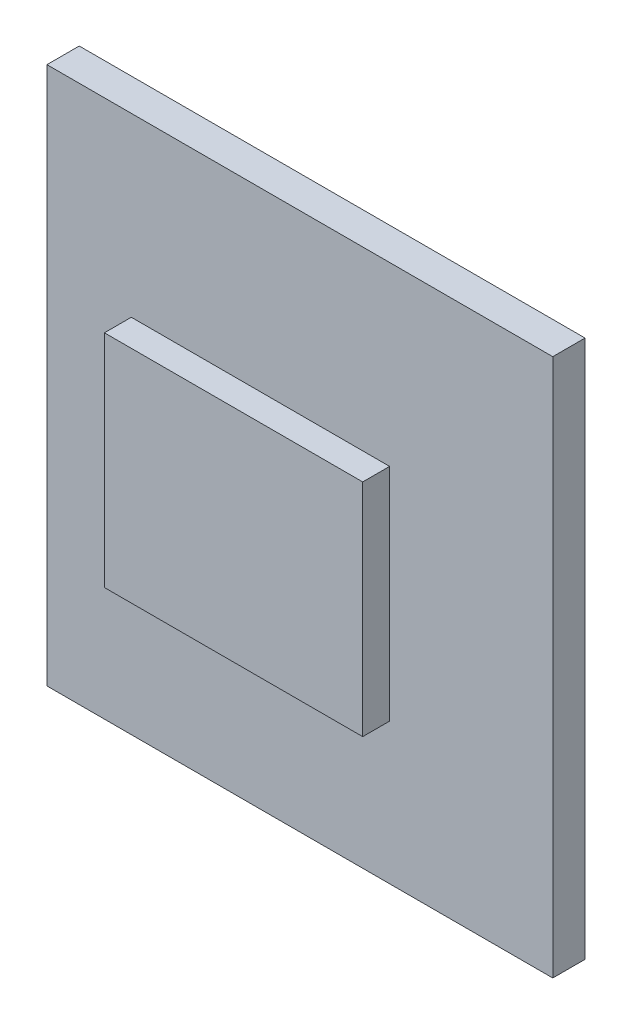
ISO-10303-21;
HEADER;
FILE_DESCRIPTION(('STEP AP214'),'2;1');
FILE_NAME('part.step','',(''),(''),'','','');
FILE_SCHEMA(('AUTOMOTIVE_DESIGN { 1 0 10303 214 1 1 1 1 }'));
ENDSEC;
DATA;
#1=APPLICATION_CONTEXT('core data for automotive mechanical design processes');
#2=APPLICATION_PROTOCOL_DEFINITION('international standard','automotive_design',2000,#1);
#3=PRODUCT_CONTEXT('',#1,'mechanical');
#4=PRODUCT('Part','Part','',(#3));
#5=PRODUCT_RELATED_PRODUCT_CATEGORY('part','',(#4));
#6=PRODUCT_DEFINITION_FORMATION('','',#4);
#7=PRODUCT_DEFINITION_CONTEXT('part definition',#1,'design');
#8=PRODUCT_DEFINITION('design','',#6,#7);
#9=PRODUCT_DEFINITION_SHAPE('','',#8);
#10=(LENGTH_UNIT() NAMED_UNIT(*) SI_UNIT(.MILLI.,.METRE.));
#11=(NAMED_UNIT(*) PLANE_ANGLE_UNIT() SI_UNIT($,.RADIAN.));
#12=(NAMED_UNIT(*) SI_UNIT($,.STERADIAN.) SOLID_ANGLE_UNIT());
#13=UNCERTAINTY_MEASURE_WITH_UNIT(LENGTH_MEASURE(1.E-05),#10,'distance_accuracy_value','');
#14=(GEOMETRIC_REPRESENTATION_CONTEXT(3) GLOBAL_UNCERTAINTY_ASSIGNED_CONTEXT((#13)) GLOBAL_UNIT_ASSIGNED_CONTEXT((#10,
#11,#12)) REPRESENTATION_CONTEXT('',''));
#15=CARTESIAN_POINT('',(0.,0.,0.));
#16=DIRECTION('',(0.,0.,1.));
#17=DIRECTION('',(1.,0.,0.));
#18=AXIS2_PLACEMENT_3D('',#15,#16,#17);
#19=CARTESIAN_POINT('',(0.,0.,0.6));
#20=DIRECTION('',(0.,0.,-1.));
#21=DIRECTION('',(-1.,0.,0.));
#22=AXIS2_PLACEMENT_3D('',#19,#20,#21);
#23=PLANE('',#22);
#24=DIRECTION('',(0.,-1.,0.));
#25=VECTOR('',#24,1.);
#26=CARTESIAN_POINT('',(0.,0.,0.6));
#27=LINE('',#26,#25);
#28=CARTESIAN_POINT('',(0.,10.,0.6));
#29=VERTEX_POINT('',#28);
#30=CARTESIAN_POINT('',(0.,0.,0.6));
#31=VERTEX_POINT('',#30);
#32=EDGE_CURVE('E130',#29,#31,#27,.T.);
#33=ORIENTED_EDGE('',*,*,#32,.T.);
#34=DIRECTION('',(1.,0.,0.));
#35=VECTOR('',#34,1.);
#36=CARTESIAN_POINT('',(0.,0.,0.6));
#37=LINE('',#36,#35);
#38=CARTESIAN_POINT('',(9.4,0.,0.6));
#39=VERTEX_POINT('',#38);
#40=EDGE_CURVE('E133',#31,#39,#37,.T.);
#41=ORIENTED_EDGE('',*,*,#40,.T.);
#42=DIRECTION('',(0.,1.,0.));
#43=VECTOR('',#42,1.);
#44=CARTESIAN_POINT('',(9.4,0.,0.6));
#45=LINE('',#44,#43);
#46=CARTESIAN_POINT('',(9.4,10.,0.6));
#47=VERTEX_POINT('',#46);
#48=EDGE_CURVE('E136',#39,#47,#45,.T.);
#49=ORIENTED_EDGE('',*,*,#48,.T.);
#50=DIRECTION('',(-1.,0.,0.));
#51=VECTOR('',#50,1.);
#52=CARTESIAN_POINT('',(0.,10.,0.6));
#53=LINE('',#52,#51);
#54=EDGE_CURVE('E138',#47,#29,#53,.T.);
#55=ORIENTED_EDGE('',*,*,#54,.T.);
#56=EDGE_LOOP('',(#33,#41,#49,#55));
#57=FACE_BOUND('',#56,.T.);
#58=DIRECTION('',(0.,-1.,0.));
#59=VECTOR('',#58,1.);
#60=CARTESIAN_POINT('',(1.56796106827479,6.71823786859166,0.6));
#61=LINE('',#60,#59);
#62=CARTESIAN_POINT('',(1.56796106827479,6.71823786859166,0.6));
#63=VERTEX_POINT('',#62);
#64=CARTESIAN_POINT('',(1.56796106827479,2.61823786859166,0.6));
#65=VERTEX_POINT('',#64);
#66=EDGE_CURVE('E120',#63,#65,#61,.T.);
#67=ORIENTED_EDGE('',*,*,#66,.F.);
#68=DIRECTION('',(-1.,0.,0.));
#69=VECTOR('',#68,1.);
#70=CARTESIAN_POINT('',(1.56796106827479,6.71823786859166,0.6));
#71=LINE('',#70,#69);
#72=CARTESIAN_POINT('',(6.36796106827479,6.71823786859166,0.6));
#73=VERTEX_POINT('',#72);
#74=EDGE_CURVE('E117',#73,#63,#71,.T.);
#75=ORIENTED_EDGE('',*,*,#74,.F.);
#76=DIRECTION('',(0.,1.,0.));
#77=VECTOR('',#76,1.);
#78=CARTESIAN_POINT('',(6.36796106827479,6.71823786859166,0.6));
#79=LINE('',#78,#77);
#80=CARTESIAN_POINT('',(6.36796106827479,2.61823786859166,0.6));
#81=VERTEX_POINT('',#80);
#82=EDGE_CURVE('E55',#81,#73,#79,.T.);
#83=ORIENTED_EDGE('',*,*,#82,.F.);
#84=DIRECTION('',(1.,0.,0.));
#85=VECTOR('',#84,1.);
#86=CARTESIAN_POINT('',(1.56796106827479,2.61823786859166,0.6));
#87=LINE('',#86,#85);
#88=EDGE_CURVE('E50',#65,#81,#87,.T.);
#89=ORIENTED_EDGE('',*,*,#88,.F.);
#90=EDGE_LOOP('',(#67,#75,#83,#89));
#91=FACE_BOUND('',#90,.T.);
#92=ADVANCED_FACE('F35',(#57,#91),#23,.F.);
#93=CARTESIAN_POINT('',(0.,0.,0.6));
#94=DIRECTION('',(1.,0.,0.));
#95=DIRECTION('',(0.,0.,-1.));
#96=AXIS2_PLACEMENT_3D('',#93,#94,#95);
#97=PLANE('',#96);
#98=DIRECTION('',(0.,-1.,0.));
#99=VECTOR('',#98,1.);
#100=CARTESIAN_POINT('',(0.,0.,0.));
#101=LINE('',#100,#99);
#102=CARTESIAN_POINT('',(0.,10.,0.));
#103=VERTEX_POINT('',#102);
#104=CARTESIAN_POINT('',(0.,0.,0.));
#105=VERTEX_POINT('',#104);
#106=EDGE_CURVE('E121',#103,#105,#101,.T.);
#107=ORIENTED_EDGE('',*,*,#106,.T.);
#108=DIRECTION('',(0.,0.,-1.));
#109=VECTOR('',#108,1.);
#110=CARTESIAN_POINT('',(0.,0.,0.6));
#111=LINE('',#110,#109);
#112=EDGE_CURVE('E11',#31,#105,#111,.T.);
#113=ORIENTED_EDGE('',*,*,#112,.F.);
#114=ORIENTED_EDGE('',*,*,#32,.F.);
#115=DIRECTION('',(0.,0.,-1.));
#116=VECTOR('',#115,1.);
#117=CARTESIAN_POINT('',(0.,10.,0.6));
#118=LINE('',#117,#116);
#119=EDGE_CURVE('E139',#29,#103,#118,.T.);
#120=ORIENTED_EDGE('',*,*,#119,.T.);
#121=EDGE_LOOP('',(#107,#113,#114,#120));
#122=FACE_BOUND('',#121,.T.);
#123=ADVANCED_FACE('F37',(#122),#97,.F.);
#124=CARTESIAN_POINT('',(0.,0.,0.6));
#125=DIRECTION('',(0.,1.,0.));
#126=DIRECTION('',(0.,0.,1.));
#127=AXIS2_PLACEMENT_3D('',#124,#125,#126);
#128=PLANE('',#127);
#129=DIRECTION('',(1.,0.,0.));
#130=VECTOR('',#129,1.);
#131=CARTESIAN_POINT('',(0.,0.,0.));
#132=LINE('',#131,#130);
#133=CARTESIAN_POINT('',(9.4,0.,0.));
#134=VERTEX_POINT('',#133);
#135=EDGE_CURVE('E124',#105,#134,#132,.T.);
#136=ORIENTED_EDGE('',*,*,#135,.T.);
#137=DIRECTION('',(0.,0.,-1.));
#138=VECTOR('',#137,1.);
#139=CARTESIAN_POINT('',(9.4,0.,0.6));
#140=LINE('',#139,#138);
#141=EDGE_CURVE('E43',#39,#134,#140,.T.);
#142=ORIENTED_EDGE('',*,*,#141,.F.);
#143=ORIENTED_EDGE('',*,*,#40,.F.);
#144=ORIENTED_EDGE('',*,*,#112,.T.);
#145=EDGE_LOOP('',(#136,#142,#143,#144));
#146=FACE_BOUND('',#145,.T.);
#147=ADVANCED_FACE('F169',(#146),#128,.F.);
#148=CARTESIAN_POINT('',(9.4,0.,0.6));
#149=DIRECTION('',(-1.,0.,0.));
#150=DIRECTION('',(0.,0.,1.));
#151=AXIS2_PLACEMENT_3D('',#148,#149,#150);
#152=PLANE('',#151);
#153=DIRECTION('',(0.,1.,0.));
#154=VECTOR('',#153,1.);
#155=CARTESIAN_POINT('',(9.4,0.,0.));
#156=LINE('',#155,#154);
#157=CARTESIAN_POINT('',(9.4,10.,0.));
#158=VERTEX_POINT('',#157);
#159=EDGE_CURVE('E142',#134,#158,#156,.T.);
#160=ORIENTED_EDGE('',*,*,#159,.T.);
#161=DIRECTION('',(0.,0.,-1.));
#162=VECTOR('',#161,1.);
#163=CARTESIAN_POINT('',(9.4,10.,0.6));
#164=LINE('',#163,#162);
#165=EDGE_CURVE('E147',#47,#158,#164,.T.);
#166=ORIENTED_EDGE('',*,*,#165,.F.);
#167=ORIENTED_EDGE('',*,*,#48,.F.);
#168=ORIENTED_EDGE('',*,*,#141,.T.);
#169=EDGE_LOOP('',(#160,#166,#167,#168));
#170=FACE_BOUND('',#169,.T.);
#171=ADVANCED_FACE('F154',(#170),#152,.F.);
#172=CARTESIAN_POINT('',(0.,10.,0.6));
#173=DIRECTION('',(0.,-1.,0.));
#174=DIRECTION('',(0.,0.,-1.));
#175=AXIS2_PLACEMENT_3D('',#172,#173,#174);
#176=PLANE('',#175);
#177=DIRECTION('',(-1.,0.,0.));
#178=VECTOR('',#177,1.);
#179=CARTESIAN_POINT('',(0.,10.,0.));
#180=LINE('',#179,#178);
#181=EDGE_CURVE('E134',#158,#103,#180,.T.);
#182=ORIENTED_EDGE('',*,*,#181,.T.);
#183=ORIENTED_EDGE('',*,*,#119,.F.);
#184=ORIENTED_EDGE('',*,*,#54,.F.);
#185=ORIENTED_EDGE('',*,*,#165,.T.);
#186=EDGE_LOOP('',(#182,#183,#184,#185));
#187=FACE_BOUND('',#186,.T.);
#188=ADVANCED_FACE('F163',(#187),#176,.F.);
#189=CARTESIAN_POINT('',(0.,0.,0.));
#190=DIRECTION('',(0.,0.,-1.));
#191=DIRECTION('',(-1.,0.,0.));
#192=AXIS2_PLACEMENT_3D('',#189,#190,#191);
#193=PLANE('',#192);
#194=ORIENTED_EDGE('',*,*,#106,.F.);
#195=ORIENTED_EDGE('',*,*,#181,.F.);
#196=ORIENTED_EDGE('',*,*,#159,.F.);
#197=ORIENTED_EDGE('',*,*,#135,.F.);
#198=EDGE_LOOP('',(#194,#195,#196,#197));
#199=FACE_BOUND('',#198,.T.);
#200=ADVANCED_FACE('F160',(#199),#193,.T.);
#201=CARTESIAN_POINT('',(1.56796106827479,6.71823786859166,1.1));
#202=DIRECTION('',(1.,0.,0.));
#203=DIRECTION('',(0.,1.,0.));
#204=AXIS2_PLACEMENT_3D('',#201,#202,#203);
#205=PLANE('',#204);
#206=ORIENTED_EDGE('',*,*,#66,.T.);
#207=DIRECTION('',(0.,0.,-1.));
#208=VECTOR('',#207,1.);
#209=CARTESIAN_POINT('',(1.56796106827479,2.61823786859166,1.1));
#210=LINE('',#209,#208);
#211=CARTESIAN_POINT('',(1.56796106827479,2.61823786859166,1.1));
#212=VERTEX_POINT('',#211);
#213=EDGE_CURVE('E101',#212,#65,#210,.T.);
#214=ORIENTED_EDGE('',*,*,#213,.F.);
#215=DIRECTION('',(0.,-1.,0.));
#216=VECTOR('',#215,1.);
#217=CARTESIAN_POINT('',(1.56796106827479,6.71823786859166,1.1));
#218=LINE('',#217,#216);
#219=CARTESIAN_POINT('',(1.56796106827479,6.71823786859166,1.1));
#220=VERTEX_POINT('',#219);
#221=EDGE_CURVE('E108',#220,#212,#218,.T.);
#222=ORIENTED_EDGE('',*,*,#221,.F.);
#223=DIRECTION('',(0.,0.,-1.));
#224=VECTOR('',#223,1.);
#225=CARTESIAN_POINT('',(1.56796106827479,6.71823786859166,1.1));
#226=LINE('',#225,#224);
#227=EDGE_CURVE('E262',#220,#63,#226,.T.);
#228=ORIENTED_EDGE('',*,*,#227,.T.);
#229=EDGE_LOOP('',(#206,#214,#222,#228));
#230=FACE_BOUND('',#229,.T.);
#231=ADVANCED_FACE('F119',(#230),#205,.F.);
#232=CARTESIAN_POINT('',(1.56796106827479,2.61823786859166,1.1));
#233=DIRECTION('',(0.,1.,0.));
#234=DIRECTION('',(0.,0.,1.));
#235=AXIS2_PLACEMENT_3D('',#232,#233,#234);
#236=PLANE('',#235);
#237=ORIENTED_EDGE('',*,*,#88,.T.);
#238=DIRECTION('',(0.,0.,-1.));
#239=VECTOR('',#238,1.);
#240=CARTESIAN_POINT('',(6.36796106827479,2.61823786859166,1.1));
#241=LINE('',#240,#239);
#242=CARTESIAN_POINT('',(6.36796106827479,2.61823786859166,1.1));
#243=VERTEX_POINT('',#242);
#244=EDGE_CURVE('E104',#243,#81,#241,.T.);
#245=ORIENTED_EDGE('',*,*,#244,.F.);
#246=DIRECTION('',(1.,0.,0.));
#247=VECTOR('',#246,1.);
#248=CARTESIAN_POINT('',(1.56796106827479,2.61823786859166,1.1));
#249=LINE('',#248,#247);
#250=EDGE_CURVE('E97',#212,#243,#249,.T.);
#251=ORIENTED_EDGE('',*,*,#250,.F.);
#252=ORIENTED_EDGE('',*,*,#213,.T.);
#253=EDGE_LOOP('',(#237,#245,#251,#252));
#254=FACE_BOUND('',#253,.T.);
#255=ADVANCED_FACE('F99',(#254),#236,.F.);
#256=CARTESIAN_POINT('',(6.36796106827479,6.71823786859166,1.1));
#257=DIRECTION('',(-1.,0.,0.));
#258=DIRECTION('',(0.,-1.,0.));
#259=AXIS2_PLACEMENT_3D('',#256,#257,#258);
#260=PLANE('',#259);
#261=ORIENTED_EDGE('',*,*,#82,.T.);
#262=DIRECTION('',(0.,0.,-1.));
#263=VECTOR('',#262,1.);
#264=CARTESIAN_POINT('',(6.36796106827479,6.71823786859166,1.1));
#265=LINE('',#264,#263);
#266=CARTESIAN_POINT('',(6.36796106827479,6.71823786859166,1.1));
#267=VERTEX_POINT('',#266);
#268=EDGE_CURVE('E126',#267,#73,#265,.T.);
#269=ORIENTED_EDGE('',*,*,#268,.F.);
#270=DIRECTION('',(0.,1.,0.));
#271=VECTOR('',#270,1.);
#272=CARTESIAN_POINT('',(6.36796106827479,6.71823786859166,1.1));
#273=LINE('',#272,#271);
#274=EDGE_CURVE('E107',#243,#267,#273,.T.);
#275=ORIENTED_EDGE('',*,*,#274,.F.);
#276=ORIENTED_EDGE('',*,*,#244,.T.);
#277=EDGE_LOOP('',(#261,#269,#275,#276));
#278=FACE_BOUND('',#277,.T.);
#279=ADVANCED_FACE('F205',(#278),#260,.F.);
#280=CARTESIAN_POINT('',(1.56796106827479,6.71823786859166,1.1));
#281=DIRECTION('',(0.,-1.,0.));
#282=DIRECTION('',(0.,0.,-1.));
#283=AXIS2_PLACEMENT_3D('',#280,#281,#282);
#284=PLANE('',#283);
#285=ORIENTED_EDGE('',*,*,#74,.T.);
#286=ORIENTED_EDGE('',*,*,#227,.F.);
#287=DIRECTION('',(-1.,0.,0.));
#288=VECTOR('',#287,1.);
#289=CARTESIAN_POINT('',(1.56796106827479,6.71823786859166,1.1));
#290=LINE('',#289,#288);
#291=EDGE_CURVE('E113',#267,#220,#290,.T.);
#292=ORIENTED_EDGE('',*,*,#291,.F.);
#293=ORIENTED_EDGE('',*,*,#268,.T.);
#294=EDGE_LOOP('',(#285,#286,#292,#293));
#295=FACE_BOUND('',#294,.T.);
#296=ADVANCED_FACE('F211',(#295),#284,.F.);
#297=CARTESIAN_POINT('',(0.,0.,1.1));
#298=DIRECTION('',(0.,0.,1.));
#299=DIRECTION('',(1.,0.,0.));
#300=AXIS2_PLACEMENT_3D('',#297,#298,#299);
#301=PLANE('',#300);
#302=ORIENTED_EDGE('',*,*,#221,.T.);
#303=ORIENTED_EDGE('',*,*,#250,.T.);
#304=ORIENTED_EDGE('',*,*,#274,.T.);
#305=ORIENTED_EDGE('',*,*,#291,.T.);
#306=EDGE_LOOP('',(#302,#303,#304,#305));
#307=FACE_BOUND('',#306,.T.);
#308=ADVANCED_FACE('F111',(#307),#301,.T.);
#309=CLOSED_SHELL('',(#92,#123,#147,#171,#188,#200,#231,#255,#279,#296,#308));
#310=MANIFOLD_SOLID_BREP('B2',#309);
#311=ADVANCED_BREP_SHAPE_REPRESENTATION('',(#18,#310),#14);
#312=SHAPE_DEFINITION_REPRESENTATION(#9,#311);
ENDSEC;
END-ISO-10303-21;
